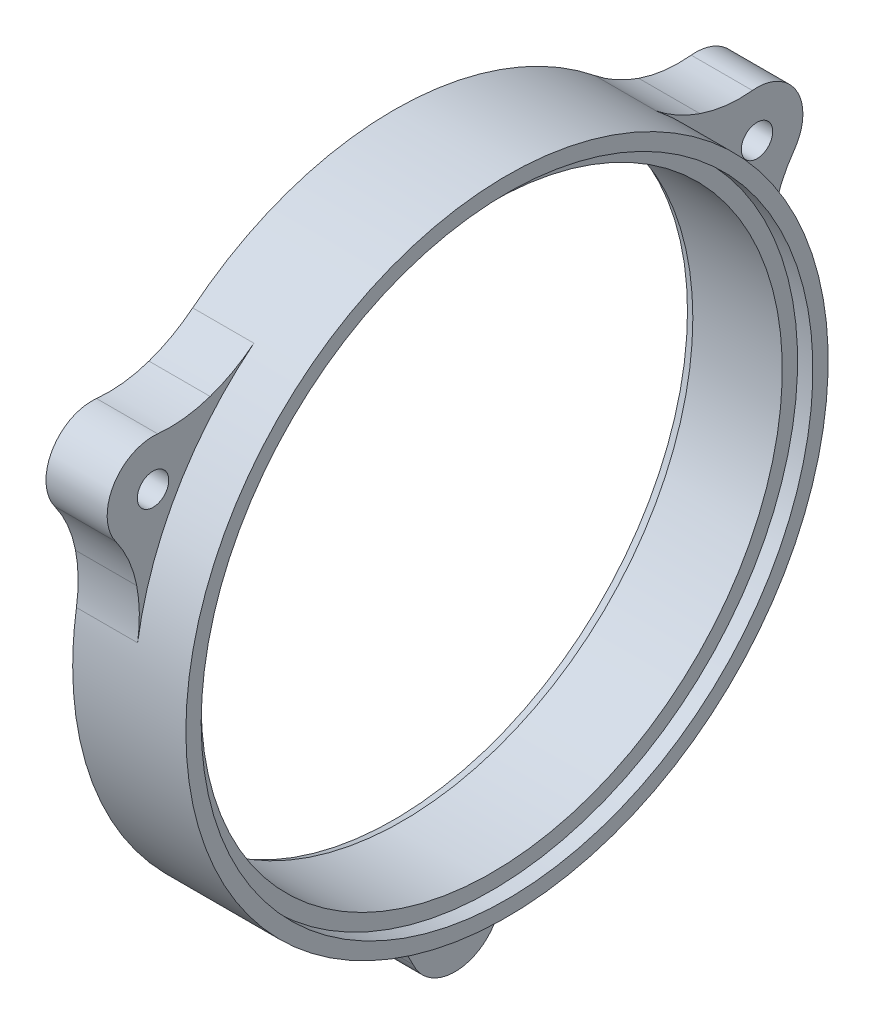
ISO-10303-21;
HEADER;
FILE_DESCRIPTION(('STEP AP214'),'2;1');
FILE_NAME('part.step','',(''),(''),'','','');
FILE_SCHEMA(('AUTOMOTIVE_DESIGN { 1 0 10303 214 1 1 1 1 }'));
ENDSEC;
DATA;
#1=APPLICATION_CONTEXT('core data for automotive mechanical design processes');
#2=APPLICATION_PROTOCOL_DEFINITION('international standard','automotive_design',2000,#1);
#3=PRODUCT_CONTEXT('',#1,'mechanical');
#4=PRODUCT('Part','Part','',(#3));
#5=PRODUCT_RELATED_PRODUCT_CATEGORY('part','',(#4));
#6=PRODUCT_DEFINITION_FORMATION('','',#4);
#7=PRODUCT_DEFINITION_CONTEXT('part definition',#1,'design');
#8=PRODUCT_DEFINITION('design','',#6,#7);
#9=PRODUCT_DEFINITION_SHAPE('','',#8);
#10=(LENGTH_UNIT() NAMED_UNIT(*) SI_UNIT(.MILLI.,.METRE.));
#11=(NAMED_UNIT(*) PLANE_ANGLE_UNIT() SI_UNIT($,.RADIAN.));
#12=(NAMED_UNIT(*) SI_UNIT($,.STERADIAN.) SOLID_ANGLE_UNIT());
#13=UNCERTAINTY_MEASURE_WITH_UNIT(LENGTH_MEASURE(1.E-05),#10,'distance_accuracy_value','');
#14=(GEOMETRIC_REPRESENTATION_CONTEXT(3) GLOBAL_UNCERTAINTY_ASSIGNED_CONTEXT((#13)) GLOBAL_UNIT_ASSIGNED_CONTEXT((#10,
#11,#12)) REPRESENTATION_CONTEXT('',''));
#15=CARTESIAN_POINT('',(0.,0.,0.));
#16=DIRECTION('',(0.,0.,1.));
#17=DIRECTION('',(1.,0.,0.));
#18=AXIS2_PLACEMENT_3D('',#15,#16,#17);
#19=CARTESIAN_POINT('',(0.,60.325,0.));
#20=DIRECTION('',(1.,0.,0.));
#21=DIRECTION('',(0.,0.,-1.));
#22=AXIS2_PLACEMENT_3D('',#19,#20,#21);
#23=PLANE('',#22);
#24=CARTESIAN_POINT('',(0.,0.,0.));
#25=DIRECTION('',(1.,0.,0.));
#26=DIRECTION('',(0.,0.,-1.));
#27=AXIS2_PLACEMENT_3D('',#24,#25,#26);
#28=CIRCLE('',#27,60.96);
#29=CARTESIAN_POINT('',(0.,0.,-60.96));
#30=VERTEX_POINT('',#29);
#31=EDGE_CURVE('E11',#30,#30,#28,.T.);
#32=ORIENTED_EDGE('',*,*,#31,.T.);
#33=EDGE_LOOP('',(#32));
#34=FACE_BOUND('',#33,.T.);
#35=CARTESIAN_POINT('',(0.,-72.39,5.27355936696949E-13));
#36=DIRECTION('',(-1.,0.,0.));
#37=DIRECTION('',(0.,0.,1.));
#38=AXIS2_PLACEMENT_3D('',#35,#36,#37);
#39=CIRCLE('',#38,3.2639);
#40=CARTESIAN_POINT('',(0.,-72.39,3.26390000000053));
#41=VERTEX_POINT('',#40);
#42=EDGE_CURVE('E336',#41,#41,#39,.T.);
#43=ORIENTED_EDGE('',*,*,#42,.F.);
#44=EDGE_LOOP('',(#43));
#45=FACE_BOUND('',#44,.T.);
#46=CARTESIAN_POINT('',(0.,36.1949999999998,-62.6915789799556));
#47=DIRECTION('',(-1.,0.,0.));
#48=DIRECTION('',(0.,0.,1.));
#49=AXIS2_PLACEMENT_3D('',#46,#47,#48);
#50=CIRCLE('',#49,3.2639);
#51=CARTESIAN_POINT('',(0.,36.1949999999998,-59.4276789799556));
#52=VERTEX_POINT('',#51);
#53=EDGE_CURVE('E255',#52,#52,#50,.T.);
#54=ORIENTED_EDGE('',*,*,#53,.F.);
#55=EDGE_LOOP('',(#54));
#56=FACE_BOUND('',#55,.T.);
#57=CARTESIAN_POINT('',(0.,0.,0.));
#58=DIRECTION('',(-1.,0.,0.));
#59=DIRECTION('',(0.,0.,1.));
#60=AXIS2_PLACEMENT_3D('',#57,#58,#59);
#61=CIRCLE('',#60,66.675);
#62=CARTESIAN_POINT('',(0.,10.1734653699422,-65.8942806878304));
#63=VERTEX_POINT('',#62);
#64=CARTESIAN_POINT('',(0.,-62.1528537247348,-24.1366608890236));
#65=VERTEX_POINT('',#64);
#66=EDGE_CURVE('E328',#63,#65,#61,.T.);
#67=ORIENTED_EDGE('',*,*,#66,.T.);
#68=CARTESIAN_POINT('',(0.,-90.5655868560422,-35.1705630097201));
#69=DIRECTION('',(1.,0.,0.));
#70=DIRECTION('',(0.,0.866025403784436,-0.500000000000004));
#71=AXIS2_PLACEMENT_3D('',#68,#69,#70);
#72=CIRCLE('',#71,30.4800000000001);
#73=CARTESIAN_POINT('',(0.,-67.5047313186697,-15.2399999999995));
#74=VERTEX_POINT('',#73);
#75=EDGE_CURVE('E245',#65,#74,#72,.T.);
#76=ORIENTED_EDGE('',*,*,#75,.T.);
#77=CARTESIAN_POINT('',(0.,-86.7221109331468,-31.8488025081));
#78=DIRECTION('',(1.,0.,0.));
#79=DIRECTION('',(0.,-0.866025403784436,0.500000000000004));
#80=AXIS2_PLACEMENT_3D('',#77,#78,#79);
#81=CIRCLE('',#80,25.4000000000001);
#82=CARTESIAN_POINT('',(0.,-76.2987575272218,-8.6860370476634));
#83=VERTEX_POINT('',#82);
#84=EDGE_CURVE('E248',#74,#83,#81,.T.);
#85=ORIENTED_EDGE('',*,*,#84,.T.);
#86=CARTESIAN_POINT('',(0.,-72.39,5.27355936696949E-13));
#87=DIRECTION('',(-1.,0.,0.));
#88=DIRECTION('',(0.,0.866025403784436,-0.500000000000004));
#89=AXIS2_PLACEMENT_3D('',#86,#87,#88);
#90=CIRCLE('',#89,9.52500000000013);
#91=CARTESIAN_POINT('',(0.,-76.2987575272218,8.68603704766442));
#92=VERTEX_POINT('',#91);
#93=EDGE_CURVE('E227',#83,#92,#90,.T.);
#94=ORIENTED_EDGE('',*,*,#93,.T.);
#95=CARTESIAN_POINT('',(0.,-86.7221109331463,31.848802508101));
#96=DIRECTION('',(1.,0.,0.));
#97=DIRECTION('',(0.,0.866025403784436,-0.500000000000004));
#98=AXIS2_PLACEMENT_3D('',#95,#96,#97);
#99=CIRCLE('',#98,25.4);
#100=CARTESIAN_POINT('',(0.,-67.5047313186694,15.2400000000005));
#101=VERTEX_POINT('',#100);
#102=EDGE_CURVE('E214',#92,#101,#99,.T.);
#103=ORIENTED_EDGE('',*,*,#102,.T.);
#104=CARTESIAN_POINT('',(0.,-90.5655868560417,35.1705630097211));
#105=DIRECTION('',(1.,0.,0.));
#106=DIRECTION('',(0.,-0.866025403784436,0.500000000000004));
#107=AXIS2_PLACEMENT_3D('',#104,#105,#106);
#108=CIRCLE('',#107,30.48);
#109=CARTESIAN_POINT('',(0.,-62.1528537247345,24.1366608890243));
#110=VERTEX_POINT('',#109);
#111=EDGE_CURVE('E61',#101,#110,#108,.T.);
#112=ORIENTED_EDGE('',*,*,#111,.T.);
#113=CARTESIAN_POINT('',(0.,10.173465369943,65.8942806878304));
#114=VERTEX_POINT('',#113);
#115=EDGE_CURVE('E331',#110,#114,#61,.T.);
#116=ORIENTED_EDGE('',*,*,#115,.T.);
#117=CARTESIAN_POINT('',(0.,14.8241923962027,96.0173804308386));
#118=DIRECTION('',(1.,0.,0.));
#119=DIRECTION('',(0.,-0.866025403784443,-0.499999999999992));
#120=AXIS2_PLACEMENT_3D('',#117,#118,#119);
#121=CIRCLE('',#120,30.4800000000001);
#122=CARTESIAN_POINT('',(0.,20.5541385056607,66.0808121976106));
#123=VERTEX_POINT('',#122);
#124=EDGE_CURVE('E208',#114,#123,#121,.T.);
#125=ORIENTED_EDGE('',*,*,#124,.T.);
#126=CARTESIAN_POINT('',(0.,15.7791834144456,91.0279523919672));
#127=DIRECTION('',(1.,0.,0.));
#128=DIRECTION('',(0.,0.866025403784443,0.499999999999992));
#129=AXIS2_PLACEMENT_3D('',#126,#127,#128);
#130=CIRCLE('',#129,25.4000000000001);
#131=CARTESIAN_POINT('',(0.,30.6270500221219,70.4196808195948));
#132=VERTEX_POINT('',#131);
#133=EDGE_CURVE('E191',#123,#132,#130,.T.);
#134=ORIENTED_EDGE('',*,*,#133,.T.);
#135=CARTESIAN_POINT('',(0.,36.1950000000007,62.6915789799551));
#136=DIRECTION('',(-1.,0.,0.));
#137=DIRECTION('',(0.,-0.866025403784443,-0.499999999999992));
#138=AXIS2_PLACEMENT_3D('',#135,#136,#137);
#139=CIRCLE('',#138,9.52500000000013);
#140=CARTESIAN_POINT('',(0.,45.6717075051013,61.7336437719308));
#141=VERTEX_POINT('',#140);
#142=EDGE_CURVE('E188',#132,#141,#139,.T.);
#143=ORIENTED_EDGE('',*,*,#142,.T.);
#144=CARTESIAN_POINT('',(0.,70.9429275187025,59.1791498838661));
#145=DIRECTION('',(1.,0.,0.));
#146=DIRECTION('',(0.,-0.866025403784443,-0.499999999999992));
#147=AXIS2_PLACEMENT_3D('',#144,#145,#146);
#148=CIRCLE('',#147,25.4);
#149=CARTESIAN_POINT('',(0.,46.9505928130102,50.8408121976102));
#150=VERTEX_POINT('',#149);
#151=EDGE_CURVE('E205',#141,#150,#148,.T.);
#152=ORIENTED_EDGE('',*,*,#151,.T.);
#153=CARTESIAN_POINT('',(0.,75.7413944598409,60.8468174211173));
#154=DIRECTION('',(1.,0.,0.));
#155=DIRECTION('',(0.,0.866025403784443,0.499999999999992));
#156=AXIS2_PLACEMENT_3D('',#153,#154,#155);
#157=CIRCLE('',#156,30.48);
#158=CARTESIAN_POINT('',(0.,51.9793883547928,41.757619798806));
#159=VERTEX_POINT('',#158);
#160=EDGE_CURVE('E54',#150,#159,#157,.T.);
#161=ORIENTED_EDGE('',*,*,#160,.T.);
#162=CARTESIAN_POINT('',(0.,51.9793883547923,-41.7576197988066));
#163=VERTEX_POINT('',#162);
#164=EDGE_CURVE('E327',#159,#163,#61,.T.);
#165=ORIENTED_EDGE('',*,*,#164,.T.);
#166=CARTESIAN_POINT('',(0.,75.7413944598402,-60.8468174211182));
#167=DIRECTION('',(1.,0.,0.));
#168=DIRECTION('',(0.,0.,1.));
#169=AXIS2_PLACEMENT_3D('',#166,#167,#168);
#170=CIRCLE('',#169,30.4800000000001);
#171=CARTESIAN_POINT('',(0.,46.9505928130095,-50.840812197611));
#172=VERTEX_POINT('',#171);
#173=EDGE_CURVE('E294',#163,#172,#170,.T.);
#174=ORIENTED_EDGE('',*,*,#173,.T.);
#175=CARTESIAN_POINT('',(0.,70.9429275187018,-59.179149883867));
#176=DIRECTION('',(1.,0.,0.));
#177=DIRECTION('',(0.,0.,-1.));
#178=AXIS2_PLACEMENT_3D('',#175,#176,#177);
#179=CIRCLE('',#178,25.4000000000001);
#180=CARTESIAN_POINT('',(0.,45.6717075051005,-61.7336437719313));
#181=VERTEX_POINT('',#180);
#182=EDGE_CURVE('E297',#172,#181,#179,.T.);
#183=ORIENTED_EDGE('',*,*,#182,.T.);
#184=CARTESIAN_POINT('',(0.,36.1949999999998,-62.6915789799556));
#185=DIRECTION('',(-1.,0.,0.));
#186=DIRECTION('',(0.,0.,1.));
#187=AXIS2_PLACEMENT_3D('',#184,#185,#186);
#188=CIRCLE('',#187,9.52500000000013);
#189=CARTESIAN_POINT('',(0.,30.627050022121,-70.4196808195953));
#190=VERTEX_POINT('',#189);
#191=EDGE_CURVE('E273',#181,#190,#188,.T.);
#192=ORIENTED_EDGE('',*,*,#191,.T.);
#193=CARTESIAN_POINT('',(0.,15.7791834144446,-91.0279523919674));
#194=DIRECTION('',(1.,0.,0.));
#195=DIRECTION('',(0.,0.,1.));
#196=AXIS2_PLACEMENT_3D('',#193,#194,#195);
#197=CIRCLE('',#196,25.4);
#198=CARTESIAN_POINT('',(0.,20.5541385056597,-66.0808121976108));
#199=VERTEX_POINT('',#198);
#200=EDGE_CURVE('E289',#190,#199,#197,.T.);
#201=ORIENTED_EDGE('',*,*,#200,.T.);
#202=CARTESIAN_POINT('',(0.,14.8241923962015,-96.0173804308387));
#203=DIRECTION('',(1.,0.,0.));
#204=DIRECTION('',(0.,0.,-1.));
#205=AXIS2_PLACEMENT_3D('',#202,#203,#204);
#206=CIRCLE('',#205,30.48);
#207=EDGE_CURVE('E292',#199,#63,#206,.T.);
#208=ORIENTED_EDGE('',*,*,#207,.T.);
#209=EDGE_LOOP('',(#67,#76,#85,#94,#103,#112,#116,#125,#134,#143,#152,#161,#165,#174,#183,#192,
#201,#208));
#210=FACE_BOUND('',#209,.T.);
#211=CARTESIAN_POINT('',(0.,36.1950000000007,62.6915789799551));
#212=DIRECTION('',(-1.,0.,0.));
#213=DIRECTION('',(0.,0.,1.));
#214=AXIS2_PLACEMENT_3D('',#211,#212,#213);
#215=CIRCLE('',#214,3.2639);
#216=CARTESIAN_POINT('',(0.,36.1950000000007,65.9554789799551));
#217=VERTEX_POINT('',#216);
#218=EDGE_CURVE('E337',#217,#217,#215,.T.);
#219=ORIENTED_EDGE('',*,*,#218,.F.);
#220=EDGE_LOOP('',(#219));
#221=FACE_BOUND('',#220,.T.);
#222=ADVANCED_FACE('F39',(#34,#45,#56,#210,#221),#23,.F.);
#223=CARTESIAN_POINT('',(0.,0.,0.));
#224=DIRECTION('',(-1.,0.,0.));
#225=DIRECTION('',(0.,0.,1.));
#226=AXIS2_PLACEMENT_3D('',#223,#224,#225);
#227=CYLINDRICAL_SURFACE('',#226,66.675);
#228=CARTESIAN_POINT('',(12.7,0.,0.));
#229=DIRECTION('',(1.,0.,0.));
#230=DIRECTION('',(0.,0.866025403784443,0.499999999999992));
#231=AXIS2_PLACEMENT_3D('',#228,#229,#230);
#232=CIRCLE('',#231,66.675);
#233=CARTESIAN_POINT('',(12.7,51.9793883547928,41.757619798806));
#234=VERTEX_POINT('',#233);
#235=CARTESIAN_POINT('',(12.7,10.173465369943,65.8942806878304));
#236=VERTEX_POINT('',#235);
#237=EDGE_CURVE('E184',#234,#236,#232,.T.);
#238=ORIENTED_EDGE('',*,*,#237,.T.);
#239=DIRECTION('',(-1.,0.,0.));
#240=VECTOR('',#239,1.);
#241=CARTESIAN_POINT('',(12.7,10.173465369943,65.8942806878304));
#242=LINE('',#241,#240);
#243=EDGE_CURVE('E219',#236,#114,#242,.T.);
#244=ORIENTED_EDGE('',*,*,#243,.T.);
#245=ORIENTED_EDGE('',*,*,#115,.F.);
#246=DIRECTION('',(-1.,0.,0.));
#247=VECTOR('',#246,1.);
#248=CARTESIAN_POINT('',(12.7,-62.1528537247345,24.1366608890243));
#249=LINE('',#248,#247);
#250=CARTESIAN_POINT('',(12.7,-62.1528537247345,24.1366608890243));
#251=VERTEX_POINT('',#250);
#252=EDGE_CURVE('E263',#251,#110,#249,.T.);
#253=ORIENTED_EDGE('',*,*,#252,.F.);
#254=CARTESIAN_POINT('',(12.7,0.,0.));
#255=DIRECTION('',(1.,0.,0.));
#256=DIRECTION('',(0.,-0.866025403784436,0.500000000000004));
#257=AXIS2_PLACEMENT_3D('',#254,#255,#256);
#258=CIRCLE('',#257,66.675);
#259=CARTESIAN_POINT('',(12.7,-62.1528537247348,-24.1366608890236));
#260=VERTEX_POINT('',#259);
#261=EDGE_CURVE('E230',#251,#260,#258,.T.);
#262=ORIENTED_EDGE('',*,*,#261,.T.);
#263=DIRECTION('',(-1.,0.,0.));
#264=VECTOR('',#263,1.);
#265=CARTESIAN_POINT('',(12.7,-62.1528537247348,-24.1366608890236));
#266=LINE('',#265,#264);
#267=EDGE_CURVE('E260',#260,#65,#266,.T.);
#268=ORIENTED_EDGE('',*,*,#267,.T.);
#269=ORIENTED_EDGE('',*,*,#66,.F.);
#270=DIRECTION('',(-1.,0.,0.));
#271=VECTOR('',#270,1.);
#272=CARTESIAN_POINT('',(12.7,10.1734653699422,-65.8942806878304));
#273=LINE('',#272,#271);
#274=CARTESIAN_POINT('',(12.7,10.1734653699422,-65.8942806878304));
#275=VERTEX_POINT('',#274);
#276=EDGE_CURVE('E312',#275,#63,#273,.T.);
#277=ORIENTED_EDGE('',*,*,#276,.F.);
#278=CARTESIAN_POINT('',(12.7,0.,0.));
#279=DIRECTION('',(1.,0.,0.));
#280=DIRECTION('',(0.,0.,-1.));
#281=AXIS2_PLACEMENT_3D('',#278,#279,#280);
#282=CIRCLE('',#281,66.675);
#283=CARTESIAN_POINT('',(12.7,51.9793883547923,-41.7576197988066));
#284=VERTEX_POINT('',#283);
#285=EDGE_CURVE('E276',#275,#284,#282,.T.);
#286=ORIENTED_EDGE('',*,*,#285,.T.);
#287=DIRECTION('',(-1.,0.,0.));
#288=VECTOR('',#287,1.);
#289=CARTESIAN_POINT('',(12.7,51.9793883547923,-41.7576197988066));
#290=LINE('',#289,#288);
#291=EDGE_CURVE('E309',#284,#163,#290,.T.);
#292=ORIENTED_EDGE('',*,*,#291,.T.);
#293=ORIENTED_EDGE('',*,*,#164,.F.);
#294=DIRECTION('',(-1.,0.,0.));
#295=VECTOR('',#294,1.);
#296=CARTESIAN_POINT('',(12.7,51.9793883547928,41.757619798806));
#297=LINE('',#296,#295);
#298=EDGE_CURVE('E173',#234,#159,#297,.T.);
#299=ORIENTED_EDGE('',*,*,#298,.F.);
#300=EDGE_LOOP('',(#238,#244,#245,#253,#262,#268,#269,#277,#286,#292,#293,#299));
#301=FACE_BOUND('',#300,.T.);
#302=CARTESIAN_POINT('',(23.495,0.,0.));
#303=DIRECTION('',(-1.,0.,0.));
#304=DIRECTION('',(0.,0.,1.));
#305=AXIS2_PLACEMENT_3D('',#302,#303,#304);
#306=CIRCLE('',#305,66.675);
#307=CARTESIAN_POINT('',(23.495,0.,66.675));
#308=VERTEX_POINT('',#307);
#309=EDGE_CURVE('E324',#308,#308,#306,.T.);
#310=ORIENTED_EDGE('',*,*,#309,.T.);
#311=EDGE_LOOP('',(#310));
#312=FACE_BOUND('',#311,.T.);
#313=ADVANCED_FACE('F355',(#301,#312),#227,.T.);
#314=CARTESIAN_POINT('',(23.495,66.675,0.));
#315=DIRECTION('',(-1.,0.,0.));
#316=DIRECTION('',(0.,0.,1.));
#317=AXIS2_PLACEMENT_3D('',#314,#315,#316);
#318=PLANE('',#317);
#319=ORIENTED_EDGE('',*,*,#309,.F.);
#320=EDGE_LOOP('',(#319));
#321=FACE_BOUND('',#320,.T.);
#322=CARTESIAN_POINT('',(23.495,0.,0.));
#323=DIRECTION('',(-1.,0.,0.));
#324=DIRECTION('',(0.,0.,1.));
#325=AXIS2_PLACEMENT_3D('',#322,#323,#324);
#326=CIRCLE('',#325,63.5);
#327=CARTESIAN_POINT('',(23.495,0.,63.5));
#328=VERTEX_POINT('',#327);
#329=EDGE_CURVE('E321',#328,#328,#326,.T.);
#330=ORIENTED_EDGE('',*,*,#329,.T.);
#331=EDGE_LOOP('',(#330));
#332=FACE_BOUND('',#331,.T.);
#333=ADVANCED_FACE('F360',(#321,#332),#318,.F.);
#334=CARTESIAN_POINT('',(0.,0.,0.));
#335=DIRECTION('',(-1.,0.,0.));
#336=DIRECTION('',(0.,0.,1.));
#337=AXIS2_PLACEMENT_3D('',#334,#335,#336);
#338=CYLINDRICAL_SURFACE('',#337,63.5);
#339=ORIENTED_EDGE('',*,*,#329,.F.);
#340=EDGE_LOOP('',(#339));
#341=FACE_BOUND('',#340,.T.);
#342=CARTESIAN_POINT('',(20.32,0.,0.));
#343=DIRECTION('',(-1.,0.,0.));
#344=DIRECTION('',(0.,0.,1.));
#345=AXIS2_PLACEMENT_3D('',#342,#343,#344);
#346=CIRCLE('',#345,63.5);
#347=CARTESIAN_POINT('',(20.32,0.,63.5));
#348=VERTEX_POINT('',#347);
#349=EDGE_CURVE('E318',#348,#348,#346,.T.);
#350=ORIENTED_EDGE('',*,*,#349,.T.);
#351=EDGE_LOOP('',(#350));
#352=FACE_BOUND('',#351,.T.);
#353=ADVANCED_FACE('F367',(#341,#352),#338,.F.);
#354=CARTESIAN_POINT('',(20.32,63.5,0.));
#355=DIRECTION('',(-1.,0.,0.));
#356=DIRECTION('',(0.,0.,1.));
#357=AXIS2_PLACEMENT_3D('',#354,#355,#356);
#358=PLANE('',#357);
#359=ORIENTED_EDGE('',*,*,#349,.F.);
#360=EDGE_LOOP('',(#359));
#361=FACE_BOUND('',#360,.T.);
#362=CARTESIAN_POINT('',(20.32,0.,0.));
#363=DIRECTION('',(-1.,0.,0.));
#364=DIRECTION('',(0.,0.,1.));
#365=AXIS2_PLACEMENT_3D('',#362,#363,#364);
#366=CIRCLE('',#365,60.325);
#367=CARTESIAN_POINT('',(20.32,0.,60.325));
#368=VERTEX_POINT('',#367);
#369=EDGE_CURVE('E304',#368,#368,#366,.T.);
#370=ORIENTED_EDGE('',*,*,#369,.T.);
#371=EDGE_LOOP('',(#370));
#372=FACE_BOUND('',#371,.T.);
#373=ADVANCED_FACE('F371',(#361,#372),#358,.F.);
#374=CARTESIAN_POINT('',(0.,0.,0.));
#375=DIRECTION('',(-1.,0.,0.));
#376=DIRECTION('',(0.,0.,1.));
#377=AXIS2_PLACEMENT_3D('',#374,#375,#376);
#378=CYLINDRICAL_SURFACE('',#377,60.325);
#379=CARTESIAN_POINT('',(1.74464816135364,0.,0.));
#380=DIRECTION('',(1.,0.,0.));
#381=DIRECTION('',(0.,0.,-1.));
#382=AXIS2_PLACEMENT_3D('',#379,#380,#381);
#383=CIRCLE('',#382,60.325);
#384=CARTESIAN_POINT('',(1.74464816135364,0.,-60.325));
#385=VERTEX_POINT('',#384);
#386=EDGE_CURVE('E47',#385,#385,#383,.F.);
#387=ORIENTED_EDGE('',*,*,#386,.T.);
#388=EDGE_LOOP('',(#387));
#389=FACE_BOUND('',#388,.T.);
#390=ORIENTED_EDGE('',*,*,#369,.F.);
#391=EDGE_LOOP('',(#390));
#392=FACE_BOUND('',#391,.T.);
#393=ADVANCED_FACE('F341',(#389,#392),#378,.F.);
#394=CARTESIAN_POINT('',(12.7,15.7791834144446,-91.0279523919674));
#395=DIRECTION('',(-1.,0.,0.));
#396=DIRECTION('',(0.,0.,1.));
#397=AXIS2_PLACEMENT_3D('',#394,#395,#396);
#398=CYLINDRICAL_SURFACE('',#397,25.4);
#399=ORIENTED_EDGE('',*,*,#200,.F.);
#400=DIRECTION('',(-1.,0.,0.));
#401=VECTOR('',#400,1.);
#402=CARTESIAN_POINT('',(12.7,30.627050022121,-70.4196808195953));
#403=LINE('',#402,#401);
#404=CARTESIAN_POINT('',(12.7,30.627050022121,-70.4196808195953));
#405=VERTEX_POINT('',#404);
#406=EDGE_CURVE('E302',#405,#190,#403,.T.);
#407=ORIENTED_EDGE('',*,*,#406,.F.);
#408=CARTESIAN_POINT('',(12.7,15.7791834144446,-91.0279523919674));
#409=DIRECTION('',(1.,0.,0.));
#410=DIRECTION('',(0.,0.,1.));
#411=AXIS2_PLACEMENT_3D('',#408,#409,#410);
#412=CIRCLE('',#411,25.4);
#413=CARTESIAN_POINT('',(12.7,20.5541385056597,-66.0808121976108));
#414=VERTEX_POINT('',#413);
#415=EDGE_CURVE('E269',#405,#414,#412,.T.);
#416=ORIENTED_EDGE('',*,*,#415,.T.);
#417=DIRECTION('',(-1.,0.,0.));
#418=VECTOR('',#417,1.);
#419=CARTESIAN_POINT('',(12.7,20.5541385056597,-66.0808121976108));
#420=LINE('',#419,#418);
#421=EDGE_CURVE('E288',#414,#199,#420,.T.);
#422=ORIENTED_EDGE('',*,*,#421,.T.);
#423=EDGE_LOOP('',(#399,#407,#416,#422));
#424=FACE_BOUND('',#423,.T.);
#425=ADVANCED_FACE('F378',(#424),#398,.F.);
#426=CARTESIAN_POINT('',(12.7,36.1949999999998,-62.6915789799556));
#427=DIRECTION('',(-1.,0.,0.));
#428=DIRECTION('',(0.,0.,1.));
#429=AXIS2_PLACEMENT_3D('',#426,#427,#428);
#430=CYLINDRICAL_SURFACE('',#429,9.52500000000013);
#431=ORIENTED_EDGE('',*,*,#191,.F.);
#432=DIRECTION('',(-1.,0.,0.));
#433=VECTOR('',#432,1.);
#434=CARTESIAN_POINT('',(12.7,45.6717075051005,-61.7336437719313));
#435=LINE('',#434,#433);
#436=CARTESIAN_POINT('',(12.7,45.6717075051005,-61.7336437719313));
#437=VERTEX_POINT('',#436);
#438=EDGE_CURVE('E305',#437,#181,#435,.T.);
#439=ORIENTED_EDGE('',*,*,#438,.F.);
#440=CARTESIAN_POINT('',(12.7,36.1949999999998,-62.6915789799556));
#441=DIRECTION('',(-1.,0.,0.));
#442=DIRECTION('',(0.,0.,1.));
#443=AXIS2_PLACEMENT_3D('',#440,#441,#442);
#444=CIRCLE('',#443,9.52500000000013);
#445=EDGE_CURVE('E285',#437,#405,#444,.T.);
#446=ORIENTED_EDGE('',*,*,#445,.T.);
#447=ORIENTED_EDGE('',*,*,#406,.T.);
#448=EDGE_LOOP('',(#431,#439,#446,#447));
#449=FACE_BOUND('',#448,.T.);
#450=ADVANCED_FACE('F381',(#449),#430,.T.);
#451=CARTESIAN_POINT('',(12.7,70.9429275187018,-59.179149883867));
#452=DIRECTION('',(-1.,0.,0.));
#453=DIRECTION('',(0.,0.,1.));
#454=AXIS2_PLACEMENT_3D('',#451,#452,#453);
#455=CYLINDRICAL_SURFACE('',#454,25.4000000000001);
#456=ORIENTED_EDGE('',*,*,#182,.F.);
#457=DIRECTION('',(-1.,0.,0.));
#458=VECTOR('',#457,1.);
#459=CARTESIAN_POINT('',(12.7,46.9505928130095,-50.840812197611));
#460=LINE('',#459,#458);
#461=CARTESIAN_POINT('',(12.7,46.9505928130095,-50.840812197611));
#462=VERTEX_POINT('',#461);
#463=EDGE_CURVE('E307',#462,#172,#460,.T.);
#464=ORIENTED_EDGE('',*,*,#463,.F.);
#465=CARTESIAN_POINT('',(12.7,70.9429275187018,-59.179149883867));
#466=DIRECTION('',(1.,0.,0.));
#467=DIRECTION('',(0.,0.,-1.));
#468=AXIS2_PLACEMENT_3D('',#465,#466,#467);
#469=CIRCLE('',#468,25.4000000000001);
#470=EDGE_CURVE('E282',#462,#437,#469,.T.);
#471=ORIENTED_EDGE('',*,*,#470,.T.);
#472=ORIENTED_EDGE('',*,*,#438,.T.);
#473=EDGE_LOOP('',(#456,#464,#471,#472));
#474=FACE_BOUND('',#473,.T.);
#475=ADVANCED_FACE('F391',(#474),#455,.F.);
#476=CARTESIAN_POINT('',(12.7,75.7413944598402,-60.8468174211182));
#477=DIRECTION('',(-1.,0.,0.));
#478=DIRECTION('',(0.,0.,1.));
#479=AXIS2_PLACEMENT_3D('',#476,#477,#478);
#480=CYLINDRICAL_SURFACE('',#479,30.4800000000001);
#481=ORIENTED_EDGE('',*,*,#173,.F.);
#482=ORIENTED_EDGE('',*,*,#291,.F.);
#483=CARTESIAN_POINT('',(12.7,75.7413944598402,-60.8468174211182));
#484=DIRECTION('',(1.,0.,0.));
#485=DIRECTION('',(0.,0.,1.));
#486=AXIS2_PLACEMENT_3D('',#483,#484,#485);
#487=CIRCLE('',#486,30.4800000000001);
#488=EDGE_CURVE('E279',#284,#462,#487,.T.);
#489=ORIENTED_EDGE('',*,*,#488,.T.);
#490=ORIENTED_EDGE('',*,*,#463,.T.);
#491=EDGE_LOOP('',(#481,#482,#489,#490));
#492=FACE_BOUND('',#491,.T.);
#493=ADVANCED_FACE('F387',(#492),#480,.F.);
#494=CARTESIAN_POINT('',(12.7,14.8241923962015,-96.0173804308387));
#495=DIRECTION('',(-1.,0.,0.));
#496=DIRECTION('',(0.,0.,1.));
#497=AXIS2_PLACEMENT_3D('',#494,#495,#496);
#498=CYLINDRICAL_SURFACE('',#497,30.48);
#499=ORIENTED_EDGE('',*,*,#207,.F.);
#500=ORIENTED_EDGE('',*,*,#421,.F.);
#501=CARTESIAN_POINT('',(12.7,14.8241923962015,-96.0173804308387));
#502=DIRECTION('',(1.,0.,0.));
#503=DIRECTION('',(0.,0.,-1.));
#504=AXIS2_PLACEMENT_3D('',#501,#502,#503);
#505=CIRCLE('',#504,30.48);
#506=EDGE_CURVE('E272',#414,#275,#505,.T.);
#507=ORIENTED_EDGE('',*,*,#506,.T.);
#508=ORIENTED_EDGE('',*,*,#276,.T.);
#509=EDGE_LOOP('',(#499,#500,#507,#508));
#510=FACE_BOUND('',#509,.T.);
#511=ADVANCED_FACE('F383',(#510),#498,.F.);
#512=CARTESIAN_POINT('',(12.7,25.9870917072222,-76.8597656859615));
#513=DIRECTION('',(-1.,0.,0.));
#514=DIRECTION('',(0.,0.,1.));
#515=AXIS2_PLACEMENT_3D('',#512,#513,#514);
#516=PLANE('',#515);
#517=CARTESIAN_POINT('',(12.7,36.1949999999998,-62.6915789799556));
#518=DIRECTION('',(-1.,0.,0.));
#519=DIRECTION('',(0.,0.,1.));
#520=AXIS2_PLACEMENT_3D('',#517,#518,#519);
#521=CIRCLE('',#520,3.2639);
#522=CARTESIAN_POINT('',(12.7,36.1949999999998,-59.4276789799556));
#523=VERTEX_POINT('',#522);
#524=EDGE_CURVE('E268',#523,#523,#521,.T.);
#525=ORIENTED_EDGE('',*,*,#524,.T.);
#526=EDGE_LOOP('',(#525));
#527=FACE_BOUND('',#526,.T.);
#528=ORIENTED_EDGE('',*,*,#415,.F.);
#529=ORIENTED_EDGE('',*,*,#445,.F.);
#530=ORIENTED_EDGE('',*,*,#470,.F.);
#531=ORIENTED_EDGE('',*,*,#488,.F.);
#532=ORIENTED_EDGE('',*,*,#285,.F.);
#533=ORIENTED_EDGE('',*,*,#506,.F.);
#534=EDGE_LOOP('',(#528,#529,#530,#531,#532,#533));
#535=FACE_BOUND('',#534,.T.);
#536=ADVANCED_FACE('F386',(#527,#535),#516,.F.);
#537=CARTESIAN_POINT('',(0.,36.1949999999998,-62.6915789799556));
#538=DIRECTION('',(-1.,0.,0.));
#539=DIRECTION('',(0.,0.,1.));
#540=AXIS2_PLACEMENT_3D('',#537,#538,#539);
#541=CYLINDRICAL_SURFACE('',#540,3.2639);
#542=ORIENTED_EDGE('',*,*,#53,.T.);
#543=EDGE_LOOP('',(#542));
#544=FACE_BOUND('',#543,.T.);
#545=ORIENTED_EDGE('',*,*,#524,.F.);
#546=EDGE_LOOP('',(#545));
#547=FACE_BOUND('',#546,.T.);
#548=ADVANCED_FACE('F401',(#544,#547),#541,.F.);
#549=CARTESIAN_POINT('',(12.7,-86.7221109331463,31.848802508101));
#550=DIRECTION('',(-1.,0.,0.));
#551=DIRECTION('',(0.,0.,1.));
#552=AXIS2_PLACEMENT_3D('',#549,#550,#551);
#553=CYLINDRICAL_SURFACE('',#552,25.4);
#554=ORIENTED_EDGE('',*,*,#102,.F.);
#555=DIRECTION('',(-1.,0.,0.));
#556=VECTOR('',#555,1.);
#557=CARTESIAN_POINT('',(12.7,-76.2987575272218,8.68603704766442));
#558=LINE('',#557,#556);
#559=CARTESIAN_POINT('',(12.7,-76.2987575272218,8.68603704766442));
#560=VERTEX_POINT('',#559);
#561=EDGE_CURVE('E253',#560,#92,#558,.T.);
#562=ORIENTED_EDGE('',*,*,#561,.F.);
#563=CARTESIAN_POINT('',(12.7,-86.7221109331463,31.848802508101));
#564=DIRECTION('',(1.,0.,0.));
#565=DIRECTION('',(0.,0.866025403784436,-0.500000000000004));
#566=AXIS2_PLACEMENT_3D('',#563,#564,#565);
#567=CIRCLE('',#566,25.4);
#568=CARTESIAN_POINT('',(12.7,-67.5047313186694,15.2400000000005));
#569=VERTEX_POINT('',#568);
#570=EDGE_CURVE('E223',#560,#569,#567,.T.);
#571=ORIENTED_EDGE('',*,*,#570,.T.);
#572=DIRECTION('',(-1.,0.,0.));
#573=VECTOR('',#572,1.);
#574=CARTESIAN_POINT('',(12.7,-67.5047313186694,15.2400000000005));
#575=LINE('',#574,#573);
#576=EDGE_CURVE('E242',#569,#101,#575,.T.);
#577=ORIENTED_EDGE('',*,*,#576,.T.);
#578=EDGE_LOOP('',(#554,#562,#571,#577));
#579=FACE_BOUND('',#578,.T.);
#580=ADVANCED_FACE('F405',(#579),#553,.F.);
#581=CARTESIAN_POINT('',(12.7,-72.39,5.27355936696949E-13));
#582=DIRECTION('',(-1.,0.,0.));
#583=DIRECTION('',(0.,0.,1.));
#584=AXIS2_PLACEMENT_3D('',#581,#582,#583);
#585=CYLINDRICAL_SURFACE('',#584,9.52500000000013);
#586=ORIENTED_EDGE('',*,*,#93,.F.);
#587=DIRECTION('',(-1.,0.,0.));
#588=VECTOR('',#587,1.);
#589=CARTESIAN_POINT('',(12.7,-76.2987575272218,-8.6860370476634));
#590=LINE('',#589,#588);
#591=CARTESIAN_POINT('',(12.7,-76.2987575272218,-8.6860370476634));
#592=VERTEX_POINT('',#591);
#593=EDGE_CURVE('E256',#592,#83,#590,.T.);
#594=ORIENTED_EDGE('',*,*,#593,.F.);
#595=CARTESIAN_POINT('',(12.7,-72.39,5.27355936696949E-13));
#596=DIRECTION('',(-1.,0.,0.));
#597=DIRECTION('',(0.,0.866025403784436,-0.500000000000004));
#598=AXIS2_PLACEMENT_3D('',#595,#596,#597);
#599=CIRCLE('',#598,9.52500000000013);
#600=EDGE_CURVE('E239',#592,#560,#599,.T.);
#601=ORIENTED_EDGE('',*,*,#600,.T.);
#602=ORIENTED_EDGE('',*,*,#561,.T.);
#603=EDGE_LOOP('',(#586,#594,#601,#602));
#604=FACE_BOUND('',#603,.T.);
#605=ADVANCED_FACE('F409',(#604),#585,.T.);
#606=CARTESIAN_POINT('',(12.7,-86.7221109331468,-31.8488025081));
#607=DIRECTION('',(-1.,0.,0.));
#608=DIRECTION('',(0.,0.,1.));
#609=AXIS2_PLACEMENT_3D('',#606,#607,#608);
#610=CYLINDRICAL_SURFACE('',#609,25.4000000000001);
#611=ORIENTED_EDGE('',*,*,#84,.F.);
#612=DIRECTION('',(-1.,0.,0.));
#613=VECTOR('',#612,1.);
#614=CARTESIAN_POINT('',(12.7,-67.5047313186697,-15.2399999999995));
#615=LINE('',#614,#613);
#616=CARTESIAN_POINT('',(12.7,-67.5047313186697,-15.2399999999995));
#617=VERTEX_POINT('',#616);
#618=EDGE_CURVE('E258',#617,#74,#615,.T.);
#619=ORIENTED_EDGE('',*,*,#618,.F.);
#620=CARTESIAN_POINT('',(12.7,-86.7221109331468,-31.8488025081));
#621=DIRECTION('',(1.,0.,0.));
#622=DIRECTION('',(0.,-0.866025403784436,0.500000000000004));
#623=AXIS2_PLACEMENT_3D('',#620,#621,#622);
#624=CIRCLE('',#623,25.4000000000001);
#625=EDGE_CURVE('E236',#617,#592,#624,.T.);
#626=ORIENTED_EDGE('',*,*,#625,.T.);
#627=ORIENTED_EDGE('',*,*,#593,.T.);
#628=EDGE_LOOP('',(#611,#619,#626,#627));
#629=FACE_BOUND('',#628,.T.);
#630=ADVANCED_FACE('F419',(#629),#610,.F.);
#631=CARTESIAN_POINT('',(12.7,-90.5655868560422,-35.1705630097201));
#632=DIRECTION('',(-1.,0.,0.));
#633=DIRECTION('',(0.,0.,1.));
#634=AXIS2_PLACEMENT_3D('',#631,#632,#633);
#635=CYLINDRICAL_SURFACE('',#634,30.4800000000001);
#636=ORIENTED_EDGE('',*,*,#75,.F.);
#637=ORIENTED_EDGE('',*,*,#267,.F.);
#638=CARTESIAN_POINT('',(12.7,-90.5655868560422,-35.1705630097201));
#639=DIRECTION('',(1.,0.,0.));
#640=DIRECTION('',(0.,0.866025403784436,-0.500000000000004));
#641=AXIS2_PLACEMENT_3D('',#638,#639,#640);
#642=CIRCLE('',#641,30.4800000000001);
#643=EDGE_CURVE('E233',#260,#617,#642,.T.);
#644=ORIENTED_EDGE('',*,*,#643,.T.);
#645=ORIENTED_EDGE('',*,*,#618,.T.);
#646=EDGE_LOOP('',(#636,#637,#644,#645));
#647=FACE_BOUND('',#646,.T.);
#648=ADVANCED_FACE('F415',(#647),#635,.F.);
#649=CARTESIAN_POINT('',(12.7,-90.5655868560417,35.1705630097211));
#650=DIRECTION('',(-1.,0.,0.));
#651=DIRECTION('',(0.,0.,1.));
#652=AXIS2_PLACEMENT_3D('',#649,#650,#651);
#653=CYLINDRICAL_SURFACE('',#652,30.48);
#654=ORIENTED_EDGE('',*,*,#111,.F.);
#655=ORIENTED_EDGE('',*,*,#576,.F.);
#656=CARTESIAN_POINT('',(12.7,-90.5655868560417,35.1705630097211));
#657=DIRECTION('',(1.,0.,0.));
#658=DIRECTION('',(0.,-0.866025403784436,0.500000000000004));
#659=AXIS2_PLACEMENT_3D('',#656,#657,#658);
#660=CIRCLE('',#659,30.48);
#661=EDGE_CURVE('E226',#569,#251,#660,.T.);
#662=ORIENTED_EDGE('',*,*,#661,.T.);
#663=ORIENTED_EDGE('',*,*,#252,.T.);
#664=EDGE_LOOP('',(#654,#655,#662,#663));
#665=FACE_BOUND('',#664,.T.);
#666=ADVANCED_FACE('F411',(#665),#653,.F.);
#667=CARTESIAN_POINT('',(12.7,-79.5560554665732,15.9244012540508));
#668=DIRECTION('',(-1.,0.,0.));
#669=DIRECTION('',(0.,0.866025403784436,-0.500000000000004));
#670=AXIS2_PLACEMENT_3D('',#667,#668,#669);
#671=PLANE('',#670);
#672=CARTESIAN_POINT('',(12.7,-72.39,5.27355936696949E-13));
#673=DIRECTION('',(-1.,0.,0.));
#674=DIRECTION('',(0.,0.,1.));
#675=AXIS2_PLACEMENT_3D('',#672,#673,#674);
#676=CIRCLE('',#675,3.2639);
#677=CARTESIAN_POINT('',(12.7,-72.39,3.26390000000053));
#678=VERTEX_POINT('',#677);
#679=EDGE_CURVE('E194',#678,#678,#676,.T.);
#680=ORIENTED_EDGE('',*,*,#679,.T.);
#681=EDGE_LOOP('',(#680));
#682=FACE_BOUND('',#681,.T.);
#683=ORIENTED_EDGE('',*,*,#570,.F.);
#684=ORIENTED_EDGE('',*,*,#600,.F.);
#685=ORIENTED_EDGE('',*,*,#625,.F.);
#686=ORIENTED_EDGE('',*,*,#643,.F.);
#687=ORIENTED_EDGE('',*,*,#261,.F.);
#688=ORIENTED_EDGE('',*,*,#661,.F.);
#689=EDGE_LOOP('',(#683,#684,#685,#686,#687,#688));
#690=FACE_BOUND('',#689,.T.);
#691=ADVANCED_FACE('F414',(#682,#690),#671,.F.);
#692=CARTESIAN_POINT('',(12.7,70.9429275187025,59.1791498838661));
#693=DIRECTION('',(-1.,0.,0.));
#694=DIRECTION('',(0.,0.,1.));
#695=AXIS2_PLACEMENT_3D('',#692,#693,#694);
#696=CYLINDRICAL_SURFACE('',#695,25.4);
#697=ORIENTED_EDGE('',*,*,#151,.F.);
#698=DIRECTION('',(-1.,0.,0.));
#699=VECTOR('',#698,1.);
#700=CARTESIAN_POINT('',(12.7,45.6717075051013,61.7336437719308));
#701=LINE('',#700,#699);
#702=CARTESIAN_POINT('',(12.7,45.6717075051013,61.7336437719308));
#703=VERTEX_POINT('',#702);
#704=EDGE_CURVE('E187',#703,#141,#701,.T.);
#705=ORIENTED_EDGE('',*,*,#704,.F.);
#706=CARTESIAN_POINT('',(12.7,70.9429275187025,59.1791498838661));
#707=DIRECTION('',(1.,0.,0.));
#708=DIRECTION('',(0.,-0.866025403784443,-0.499999999999992));
#709=AXIS2_PLACEMENT_3D('',#706,#707,#708);
#710=CIRCLE('',#709,25.4);
#711=CARTESIAN_POINT('',(12.7,46.9505928130102,50.8408121976102));
#712=VERTEX_POINT('',#711);
#713=EDGE_CURVE('E180',#703,#712,#710,.T.);
#714=ORIENTED_EDGE('',*,*,#713,.T.);
#715=DIRECTION('',(-1.,0.,0.));
#716=VECTOR('',#715,1.);
#717=CARTESIAN_POINT('',(12.7,46.9505928130102,50.8408121976102));
#718=LINE('',#717,#716);
#719=EDGE_CURVE('E165',#712,#150,#718,.T.);
#720=ORIENTED_EDGE('',*,*,#719,.T.);
#721=EDGE_LOOP('',(#697,#705,#714,#720));
#722=FACE_BOUND('',#721,.T.);
#723=ADVANCED_FACE('F186',(#722),#696,.F.);
#724=CARTESIAN_POINT('',(12.7,36.1950000000007,62.6915789799551));
#725=DIRECTION('',(-1.,0.,0.));
#726=DIRECTION('',(0.,0.,1.));
#727=AXIS2_PLACEMENT_3D('',#724,#725,#726);
#728=CYLINDRICAL_SURFACE('',#727,9.52500000000013);
#729=ORIENTED_EDGE('',*,*,#142,.F.);
#730=DIRECTION('',(-1.,0.,0.));
#731=VECTOR('',#730,1.);
#732=CARTESIAN_POINT('',(12.7,30.6270500221219,70.4196808195948));
#733=LINE('',#732,#731);
#734=CARTESIAN_POINT('',(12.7,30.6270500221219,70.4196808195948));
#735=VERTEX_POINT('',#734);
#736=EDGE_CURVE('E215',#735,#132,#733,.T.);
#737=ORIENTED_EDGE('',*,*,#736,.F.);
#738=CARTESIAN_POINT('',(12.7,36.1950000000007,62.6915789799551));
#739=DIRECTION('',(-1.,0.,0.));
#740=DIRECTION('',(0.,-0.866025403784443,-0.499999999999992));
#741=AXIS2_PLACEMENT_3D('',#738,#739,#740);
#742=CIRCLE('',#741,9.52500000000013);
#743=EDGE_CURVE('E174',#735,#703,#742,.T.);
#744=ORIENTED_EDGE('',*,*,#743,.T.);
#745=ORIENTED_EDGE('',*,*,#704,.T.);
#746=EDGE_LOOP('',(#729,#737,#744,#745));
#747=FACE_BOUND('',#746,.T.);
#748=ADVANCED_FACE('F432',(#747),#728,.T.);
#749=CARTESIAN_POINT('',(12.7,15.7791834144456,91.0279523919672));
#750=DIRECTION('',(-1.,0.,0.));
#751=DIRECTION('',(0.,0.,1.));
#752=AXIS2_PLACEMENT_3D('',#749,#750,#751);
#753=CYLINDRICAL_SURFACE('',#752,25.4000000000001);
#754=ORIENTED_EDGE('',*,*,#133,.F.);
#755=DIRECTION('',(-1.,0.,0.));
#756=VECTOR('',#755,1.);
#757=CARTESIAN_POINT('',(12.7,20.5541385056607,66.0808121976106));
#758=LINE('',#757,#756);
#759=CARTESIAN_POINT('',(12.7,20.5541385056607,66.0808121976106));
#760=VERTEX_POINT('',#759);
#761=EDGE_CURVE('E217',#760,#123,#758,.T.);
#762=ORIENTED_EDGE('',*,*,#761,.F.);
#763=CARTESIAN_POINT('',(12.7,15.7791834144456,91.0279523919672));
#764=DIRECTION('',(1.,0.,0.));
#765=DIRECTION('',(0.,0.866025403784443,0.499999999999992));
#766=AXIS2_PLACEMENT_3D('',#763,#764,#765);
#767=CIRCLE('',#766,25.4000000000001);
#768=EDGE_CURVE('E201',#760,#735,#767,.T.);
#769=ORIENTED_EDGE('',*,*,#768,.T.);
#770=ORIENTED_EDGE('',*,*,#736,.T.);
#771=EDGE_LOOP('',(#754,#762,#769,#770));
#772=FACE_BOUND('',#771,.T.);
#773=ADVANCED_FACE('F438',(#772),#753,.F.);
#774=CARTESIAN_POINT('',(12.7,14.8241923962027,96.0173804308386));
#775=DIRECTION('',(-1.,0.,0.));
#776=DIRECTION('',(0.,0.,1.));
#777=AXIS2_PLACEMENT_3D('',#774,#775,#776);
#778=CYLINDRICAL_SURFACE('',#777,30.4800000000001);
#779=ORIENTED_EDGE('',*,*,#124,.F.);
#780=ORIENTED_EDGE('',*,*,#243,.F.);
#781=CARTESIAN_POINT('',(12.7,14.8241923962027,96.0173804308386));
#782=DIRECTION('',(1.,0.,0.));
#783=DIRECTION('',(0.,-0.866025403784443,-0.499999999999992));
#784=AXIS2_PLACEMENT_3D('',#781,#782,#783);
#785=CIRCLE('',#784,30.4800000000001);
#786=EDGE_CURVE('E198',#236,#760,#785,.T.);
#787=ORIENTED_EDGE('',*,*,#786,.T.);
#788=ORIENTED_EDGE('',*,*,#761,.T.);
#789=EDGE_LOOP('',(#779,#780,#787,#788));
#790=FACE_BOUND('',#789,.T.);
#791=ADVANCED_FACE('F435',(#790),#778,.F.);
#792=CARTESIAN_POINT('',(12.7,75.7413944598409,60.8468174211173));
#793=DIRECTION('',(-1.,0.,0.));
#794=DIRECTION('',(0.,0.,1.));
#795=AXIS2_PLACEMENT_3D('',#792,#793,#794);
#796=CYLINDRICAL_SURFACE('',#795,30.48);
#797=ORIENTED_EDGE('',*,*,#160,.F.);
#798=ORIENTED_EDGE('',*,*,#719,.F.);
#799=CARTESIAN_POINT('',(12.7,75.7413944598409,60.8468174211173));
#800=DIRECTION('',(1.,0.,0.));
#801=DIRECTION('',(0.,0.866025403784443,0.499999999999992));
#802=AXIS2_PLACEMENT_3D('',#799,#800,#801);
#803=CIRCLE('',#802,30.48);
#804=EDGE_CURVE('E168',#712,#234,#803,.T.);
#805=ORIENTED_EDGE('',*,*,#804,.T.);
#806=ORIENTED_EDGE('',*,*,#298,.T.);
#807=EDGE_LOOP('',(#797,#798,#805,#806));
#808=FACE_BOUND('',#807,.T.);
#809=ADVANCED_FACE('F167',(#808),#796,.F.);
#810=CARTESIAN_POINT('',(12.7,53.5689637593516,60.9353644319106));
#811=DIRECTION('',(-1.,0.,0.));
#812=DIRECTION('',(0.,-0.866025403784443,-0.499999999999992));
#813=AXIS2_PLACEMENT_3D('',#810,#811,#812);
#814=PLANE('',#813);
#815=CARTESIAN_POINT('',(12.7,36.1950000000007,62.6915789799551));
#816=DIRECTION('',(-1.,0.,0.));
#817=DIRECTION('',(0.,0.,1.));
#818=AXIS2_PLACEMENT_3D('',#815,#816,#817);
#819=CIRCLE('',#818,3.2639);
#820=CARTESIAN_POINT('',(12.7,36.1950000000007,65.9554789799551));
#821=VERTEX_POINT('',#820);
#822=EDGE_CURVE('E334',#821,#821,#819,.T.);
#823=ORIENTED_EDGE('',*,*,#822,.T.);
#824=EDGE_LOOP('',(#823));
#825=FACE_BOUND('',#824,.T.);
#826=ORIENTED_EDGE('',*,*,#713,.F.);
#827=ORIENTED_EDGE('',*,*,#743,.F.);
#828=ORIENTED_EDGE('',*,*,#768,.F.);
#829=ORIENTED_EDGE('',*,*,#786,.F.);
#830=ORIENTED_EDGE('',*,*,#237,.F.);
#831=ORIENTED_EDGE('',*,*,#804,.F.);
#832=EDGE_LOOP('',(#826,#827,#828,#829,#830,#831));
#833=FACE_BOUND('',#832,.T.);
#834=ADVANCED_FACE('F178',(#825,#833),#814,.F.);
#835=CARTESIAN_POINT('',(0.,-72.39,5.27355936696949E-13));
#836=DIRECTION('',(-1.,0.,0.));
#837=DIRECTION('',(0.,0.,1.));
#838=AXIS2_PLACEMENT_3D('',#835,#836,#837);
#839=CYLINDRICAL_SURFACE('',#838,3.2639);
#840=ORIENTED_EDGE('',*,*,#42,.T.);
#841=EDGE_LOOP('',(#840));
#842=FACE_BOUND('',#841,.T.);
#843=ORIENTED_EDGE('',*,*,#679,.F.);
#844=EDGE_LOOP('',(#843));
#845=FACE_BOUND('',#844,.T.);
#846=ADVANCED_FACE('F350',(#842,#845),#839,.F.);
#847=CARTESIAN_POINT('',(0.,36.1950000000007,62.6915789799551));
#848=DIRECTION('',(-1.,0.,0.));
#849=DIRECTION('',(0.,0.,1.));
#850=AXIS2_PLACEMENT_3D('',#847,#848,#849);
#851=CYLINDRICAL_SURFACE('',#850,3.2639);
#852=ORIENTED_EDGE('',*,*,#218,.T.);
#853=EDGE_LOOP('',(#852));
#854=FACE_BOUND('',#853,.T.);
#855=ORIENTED_EDGE('',*,*,#822,.F.);
#856=EDGE_LOOP('',(#855));
#857=FACE_BOUND('',#856,.T.);
#858=ADVANCED_FACE('F345',(#854,#857),#851,.F.);
#859=CARTESIAN_POINT('',(1.74464816135364,0.,0.));
#860=DIRECTION('',(-1.,0.,0.));
#861=DIRECTION('',(0.,0.,1.));
#862=AXIS2_PLACEMENT_3D('',#859,#860,#861);
#863=CONICAL_SURFACE('',#862,60.325,0.349065850398865);
#864=ORIENTED_EDGE('',*,*,#31,.F.);
#865=EDGE_LOOP('',(#864));
#866=FACE_BOUND('',#865,.T.);
#867=ORIENTED_EDGE('',*,*,#386,.F.);
#868=EDGE_LOOP('',(#867));
#869=FACE_BOUND('',#868,.T.);
#870=ADVANCED_FACE('F41',(#866,#869),#863,.F.);
#871=CLOSED_SHELL('',(#222,#313,#333,#353,#373,#393,#425,#450,#475,#493,#511,#536,#548,#580,
#605,#630,#648,#666,#691,#723,#748,#773,#791,#809,#834,#846,#858,#870));
#872=MANIFOLD_SOLID_BREP('B2',#871);
#873=ADVANCED_BREP_SHAPE_REPRESENTATION('',(#18,#872),#14);
#874=SHAPE_DEFINITION_REPRESENTATION(#9,#873);
ENDSEC;
END-ISO-10303-21;
